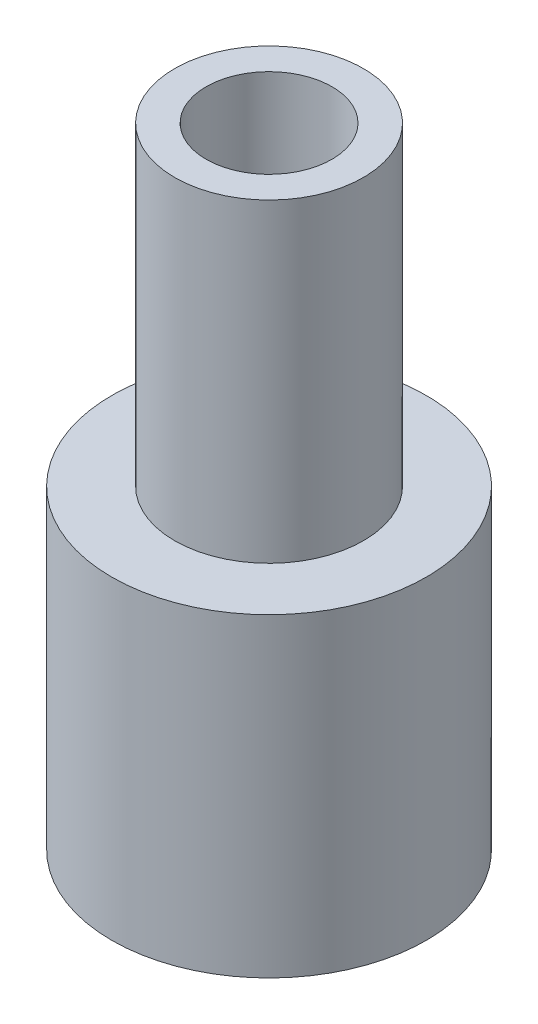
ISO-10303-21;
HEADER;
FILE_DESCRIPTION(('STEP AP214'),'2;1');
FILE_NAME('part.step','',(''),(''),'','','');
FILE_SCHEMA(('AUTOMOTIVE_DESIGN { 1 0 10303 214 1 1 1 1 }'));
ENDSEC;
DATA;
#1=APPLICATION_CONTEXT('core data for automotive mechanical design processes');
#2=APPLICATION_PROTOCOL_DEFINITION('international standard','automotive_design',2000,#1);
#3=PRODUCT_CONTEXT('',#1,'mechanical');
#4=PRODUCT('Part','Part','',(#3));
#5=PRODUCT_RELATED_PRODUCT_CATEGORY('part','',(#4));
#6=PRODUCT_DEFINITION_FORMATION('','',#4);
#7=PRODUCT_DEFINITION_CONTEXT('part definition',#1,'design');
#8=PRODUCT_DEFINITION('design','',#6,#7);
#9=PRODUCT_DEFINITION_SHAPE('','',#8);
#10=(LENGTH_UNIT() NAMED_UNIT(*) SI_UNIT(.MILLI.,.METRE.));
#11=(NAMED_UNIT(*) PLANE_ANGLE_UNIT() SI_UNIT($,.RADIAN.));
#12=(NAMED_UNIT(*) SI_UNIT($,.STERADIAN.) SOLID_ANGLE_UNIT());
#13=UNCERTAINTY_MEASURE_WITH_UNIT(LENGTH_MEASURE(1.E-05),#10,'distance_accuracy_value','');
#14=(GEOMETRIC_REPRESENTATION_CONTEXT(3) GLOBAL_UNCERTAINTY_ASSIGNED_CONTEXT((#13)) GLOBAL_UNIT_ASSIGNED_CONTEXT((#10,
#11,#12)) REPRESENTATION_CONTEXT('',''));
#15=CARTESIAN_POINT('',(0.,0.,0.));
#16=DIRECTION('',(0.,0.,1.));
#17=DIRECTION('',(1.,0.,0.));
#18=AXIS2_PLACEMENT_3D('',#15,#16,#17);
#19=CARTESIAN_POINT('',(0.,10.,0.));
#20=DIRECTION('',(0.,-1.,0.));
#21=DIRECTION('',(0.,0.,-1.));
#22=AXIS2_PLACEMENT_3D('',#19,#20,#21);
#23=CYLINDRICAL_SURFACE('',#22,5.);
#24=CARTESIAN_POINT('',(0.,10.,0.));
#25=DIRECTION('',(0.,1.,0.));
#26=DIRECTION('',(0.,0.,1.));
#27=AXIS2_PLACEMENT_3D('',#24,#25,#26);
#28=CIRCLE('',#27,5.);
#29=CARTESIAN_POINT('',(0.,10.,5.));
#30=VERTEX_POINT('',#29);
#31=EDGE_CURVE('E45',#30,#30,#28,.T.);
#32=ORIENTED_EDGE('',*,*,#31,.F.);
#33=EDGE_LOOP('',(#32));
#34=FACE_BOUND('',#33,.T.);
#35=CARTESIAN_POINT('',(0.,0.,0.));
#36=DIRECTION('',(0.,1.,0.));
#37=DIRECTION('',(0.,0.,1.));
#38=AXIS2_PLACEMENT_3D('',#35,#36,#37);
#39=CIRCLE('',#38,5.);
#40=CARTESIAN_POINT('',(0.,0.,5.));
#41=VERTEX_POINT('',#40);
#42=EDGE_CURVE('E40',#41,#41,#39,.T.);
#43=ORIENTED_EDGE('',*,*,#42,.T.);
#44=EDGE_LOOP('',(#43));
#45=FACE_BOUND('',#44,.T.);
#46=ADVANCED_FACE('F37',(#34,#45),#23,.T.);
#47=CARTESIAN_POINT('',(0.,10.,0.));
#48=DIRECTION('',(0.,1.,0.));
#49=DIRECTION('',(0.,0.,1.));
#50=AXIS2_PLACEMENT_3D('',#47,#48,#49);
#51=PLANE('',#50);
#52=CARTESIAN_POINT('',(0.,10.,0.));
#53=DIRECTION('',(0.,1.,0.));
#54=DIRECTION('',(0.,0.,1.));
#55=AXIS2_PLACEMENT_3D('',#52,#53,#54);
#56=CIRCLE('',#55,3.);
#57=CARTESIAN_POINT('',(0.,10.,3.));
#58=VERTEX_POINT('',#57);
#59=EDGE_CURVE('E10',#58,#58,#56,.T.);
#60=ORIENTED_EDGE('',*,*,#59,.F.);
#61=EDGE_LOOP('',(#60));
#62=FACE_BOUND('',#61,.T.);
#63=ORIENTED_EDGE('',*,*,#31,.T.);
#64=EDGE_LOOP('',(#63));
#65=FACE_BOUND('',#64,.T.);
#66=ADVANCED_FACE('F80',(#62,#65),#51,.T.);
#67=CARTESIAN_POINT('',(0.,0.,0.));
#68=DIRECTION('',(0.,1.,0.));
#69=DIRECTION('',(0.,0.,1.));
#70=AXIS2_PLACEMENT_3D('',#67,#68,#69);
#71=PLANE('',#70);
#72=ORIENTED_EDGE('',*,*,#42,.F.);
#73=EDGE_LOOP('',(#72));
#74=FACE_BOUND('',#73,.T.);
#75=ADVANCED_FACE('F75',(#74),#71,.F.);
#76=CARTESIAN_POINT('',(0.,20.,0.));
#77=DIRECTION('',(0.,-1.,0.));
#78=DIRECTION('',(0.,0.,-1.));
#79=AXIS2_PLACEMENT_3D('',#76,#77,#78);
#80=CYLINDRICAL_SURFACE('',#79,3.);
#81=CARTESIAN_POINT('',(0.,20.,0.));
#82=DIRECTION('',(0.,1.,0.));
#83=DIRECTION('',(0.,0.,1.));
#84=AXIS2_PLACEMENT_3D('',#81,#82,#83);
#85=CIRCLE('',#84,3.);
#86=CARTESIAN_POINT('',(0.,20.,3.));
#87=VERTEX_POINT('',#86);
#88=EDGE_CURVE('E52',#87,#87,#85,.T.);
#89=ORIENTED_EDGE('',*,*,#88,.F.);
#90=EDGE_LOOP('',(#89));
#91=FACE_BOUND('',#90,.T.);
#92=ORIENTED_EDGE('',*,*,#59,.T.);
#93=EDGE_LOOP('',(#92));
#94=FACE_BOUND('',#93,.T.);
#95=ADVANCED_FACE('F70',(#91,#94),#80,.T.);
#96=CARTESIAN_POINT('',(0.,20.,0.));
#97=DIRECTION('',(0.,1.,0.));
#98=DIRECTION('',(0.,0.,1.));
#99=AXIS2_PLACEMENT_3D('',#96,#97,#98);
#100=PLANE('',#99);
#101=CARTESIAN_POINT('',(0.,20.,0.));
#102=DIRECTION('',(0.,1.,0.));
#103=DIRECTION('',(0.,0.,1.));
#104=AXIS2_PLACEMENT_3D('',#101,#102,#103);
#105=CIRCLE('',#104,2.);
#106=CARTESIAN_POINT('',(0.,20.,2.));
#107=VERTEX_POINT('',#106);
#108=EDGE_CURVE('E60',#107,#107,#105,.T.);
#109=ORIENTED_EDGE('',*,*,#108,.F.);
#110=EDGE_LOOP('',(#109));
#111=FACE_BOUND('',#110,.T.);
#112=ORIENTED_EDGE('',*,*,#88,.T.);
#113=EDGE_LOOP('',(#112));
#114=FACE_BOUND('',#113,.T.);
#115=ADVANCED_FACE('F67',(#111,#114),#100,.T.);
#116=CARTESIAN_POINT('',(0.,4.34314575050762,0.));
#117=DIRECTION('',(0.,1.,0.));
#118=DIRECTION('',(0.,0.,1.));
#119=AXIS2_PLACEMENT_3D('',#116,#117,#118);
#120=CYLINDRICAL_SURFACE('',#119,2.);
#121=CARTESIAN_POINT('',(0.,10.,0.));
#122=DIRECTION('',(0.,1.,0.));
#123=DIRECTION('',(0.,0.,1.));
#124=AXIS2_PLACEMENT_3D('',#121,#122,#123);
#125=CIRCLE('',#124,2.);
#126=CARTESIAN_POINT('',(0.,10.,2.));
#127=VERTEX_POINT('',#126);
#128=EDGE_CURVE('E56',#127,#127,#125,.F.);
#129=ORIENTED_EDGE('',*,*,#128,.T.);
#130=EDGE_LOOP('',(#129));
#131=FACE_BOUND('',#130,.T.);
#132=ORIENTED_EDGE('',*,*,#108,.T.);
#133=EDGE_LOOP('',(#132));
#134=FACE_BOUND('',#133,.T.);
#135=ADVANCED_FACE('F65',(#131,#134),#120,.F.);
#136=CARTESIAN_POINT('',(0.,10.,0.));
#137=DIRECTION('',(0.,1.,0.));
#138=DIRECTION('',(0.,0.,1.));
#139=AXIS2_PLACEMENT_3D('',#136,#137,#138);
#140=PLANE('',#139);
#141=ORIENTED_EDGE('',*,*,#128,.F.);
#142=EDGE_LOOP('',(#141));
#143=FACE_BOUND('',#142,.T.);
#144=ADVANCED_FACE('F126',(#143),#140,.T.);
#145=CLOSED_SHELL('',(#46,#66,#75,#95,#115,#135,#144));
#146=MANIFOLD_SOLID_BREP('B2',#145);
#147=ADVANCED_BREP_SHAPE_REPRESENTATION('',(#18,#146),#14);
#148=SHAPE_DEFINITION_REPRESENTATION(#9,#147);
ENDSEC;
END-ISO-10303-21;
